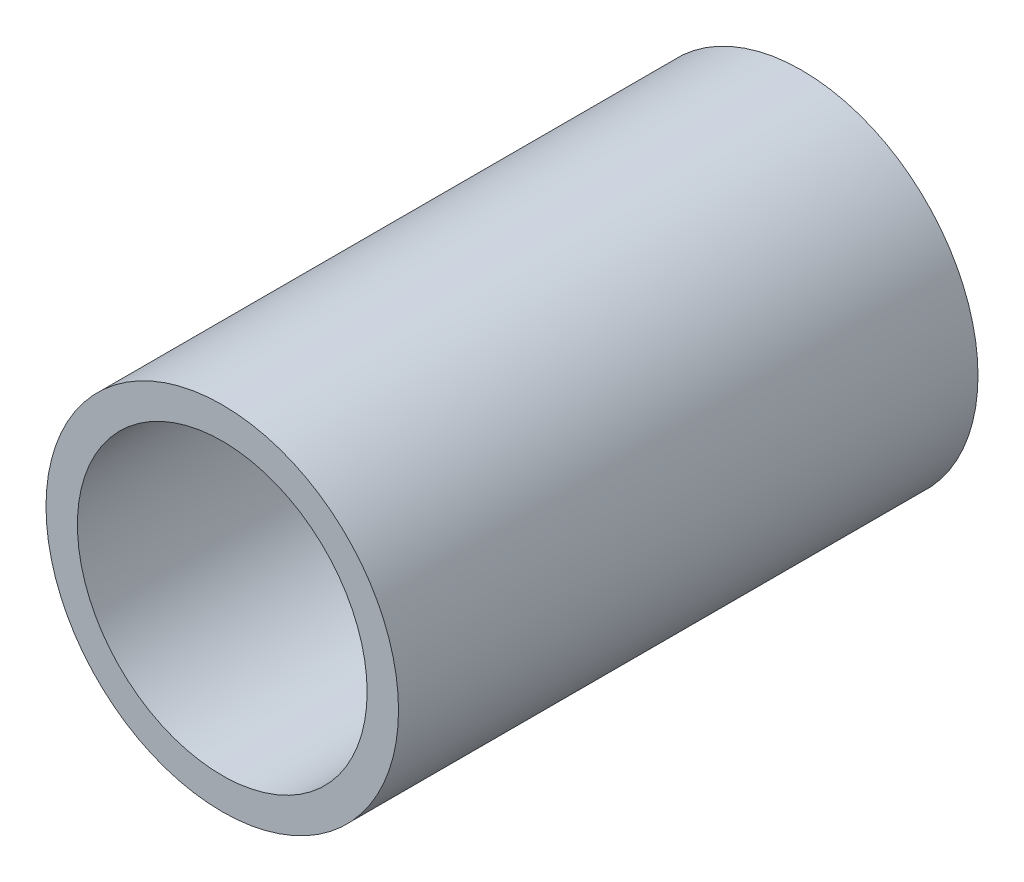
ISO-10303-21;
HEADER;
FILE_DESCRIPTION(('STEP AP214'),'2;1');
FILE_NAME('part.step','',(''),(''),'','','');
FILE_SCHEMA(('AUTOMOTIVE_DESIGN { 1 0 10303 214 1 1 1 1 }'));
ENDSEC;
DATA;
#1=APPLICATION_CONTEXT('core data for automotive mechanical design processes');
#2=APPLICATION_PROTOCOL_DEFINITION('international standard','automotive_design',2000,#1);
#3=PRODUCT_CONTEXT('',#1,'mechanical');
#4=PRODUCT('Part','Part','',(#3));
#5=PRODUCT_RELATED_PRODUCT_CATEGORY('part','',(#4));
#6=PRODUCT_DEFINITION_FORMATION('','',#4);
#7=PRODUCT_DEFINITION_CONTEXT('part definition',#1,'design');
#8=PRODUCT_DEFINITION('design','',#6,#7);
#9=PRODUCT_DEFINITION_SHAPE('','',#8);
#10=(LENGTH_UNIT() NAMED_UNIT(*) SI_UNIT(.MILLI.,.METRE.));
#11=(NAMED_UNIT(*) PLANE_ANGLE_UNIT() SI_UNIT($,.RADIAN.));
#12=(NAMED_UNIT(*) SI_UNIT($,.STERADIAN.) SOLID_ANGLE_UNIT());
#13=UNCERTAINTY_MEASURE_WITH_UNIT(LENGTH_MEASURE(1.E-05),#10,'distance_accuracy_value','');
#14=(GEOMETRIC_REPRESENTATION_CONTEXT(3) GLOBAL_UNCERTAINTY_ASSIGNED_CONTEXT((#13)) GLOBAL_UNIT_ASSIGNED_CONTEXT((#10,
#11,#12)) REPRESENTATION_CONTEXT('',''));
#15=CARTESIAN_POINT('',(0.,0.,0.));
#16=DIRECTION('',(0.,0.,1.));
#17=DIRECTION('',(1.,0.,0.));
#18=AXIS2_PLACEMENT_3D('',#15,#16,#17);
#19=CARTESIAN_POINT('',(0.,0.,12.));
#20=DIRECTION('',(0.,0.,1.));
#21=DIRECTION('',(1.,0.,0.));
#22=AXIS2_PLACEMENT_3D('',#19,#20,#21);
#23=PLANE('',#22);
#24=CARTESIAN_POINT('',(0.,0.,12.));
#25=DIRECTION('',(0.,0.,1.));
#26=DIRECTION('',(1.,0.,0.));
#27=AXIS2_PLACEMENT_3D('',#24,#25,#26);
#28=CIRCLE('',#27,3.65);
#29=CARTESIAN_POINT('',(3.65,0.,12.));
#30=VERTEX_POINT('',#29);
#31=EDGE_CURVE('E10',#30,#30,#28,.T.);
#32=ORIENTED_EDGE('',*,*,#31,.T.);
#33=EDGE_LOOP('',(#32));
#34=FACE_BOUND('',#33,.T.);
#35=CARTESIAN_POINT('',(0.,0.,12.));
#36=DIRECTION('',(0.,0.,1.));
#37=DIRECTION('',(1.,0.,0.));
#38=AXIS2_PLACEMENT_3D('',#35,#36,#37);
#39=CIRCLE('',#38,3.);
#40=CARTESIAN_POINT('',(3.,0.,12.));
#41=VERTEX_POINT('',#40);
#42=EDGE_CURVE('E41',#41,#41,#39,.T.);
#43=ORIENTED_EDGE('',*,*,#42,.F.);
#44=EDGE_LOOP('',(#43));
#45=FACE_BOUND('',#44,.T.);
#46=ADVANCED_FACE('F30',(#34,#45),#23,.T.);
#47=CARTESIAN_POINT('',(0.,0.,0.));
#48=DIRECTION('',(0.,0.,1.));
#49=DIRECTION('',(1.,0.,0.));
#50=AXIS2_PLACEMENT_3D('',#47,#48,#49);
#51=PLANE('',#50);
#52=CARTESIAN_POINT('',(0.,0.,0.));
#53=DIRECTION('',(0.,0.,1.));
#54=DIRECTION('',(1.,0.,0.));
#55=AXIS2_PLACEMENT_3D('',#52,#53,#54);
#56=CIRCLE('',#55,3.65);
#57=CARTESIAN_POINT('',(3.65,0.,0.));
#58=VERTEX_POINT('',#57);
#59=EDGE_CURVE('E34',#58,#58,#56,.T.);
#60=ORIENTED_EDGE('',*,*,#59,.F.);
#61=EDGE_LOOP('',(#60));
#62=FACE_BOUND('',#61,.T.);
#63=CARTESIAN_POINT('',(0.,0.,0.));
#64=DIRECTION('',(0.,0.,1.));
#65=DIRECTION('',(1.,0.,0.));
#66=AXIS2_PLACEMENT_3D('',#63,#64,#65);
#67=CIRCLE('',#66,3.);
#68=CARTESIAN_POINT('',(3.,0.,0.));
#69=VERTEX_POINT('',#68);
#70=EDGE_CURVE('E43',#69,#69,#67,.T.);
#71=ORIENTED_EDGE('',*,*,#70,.T.);
#72=EDGE_LOOP('',(#71));
#73=FACE_BOUND('',#72,.T.);
#74=ADVANCED_FACE('F53',(#62,#73),#51,.F.);
#75=CARTESIAN_POINT('',(0.,0.,12.));
#76=DIRECTION('',(0.,0.,-1.));
#77=DIRECTION('',(-1.,0.,0.));
#78=AXIS2_PLACEMENT_3D('',#75,#76,#77);
#79=CYLINDRICAL_SURFACE('',#78,3.65);
#80=ORIENTED_EDGE('',*,*,#31,.F.);
#81=EDGE_LOOP('',(#80));
#82=FACE_BOUND('',#81,.T.);
#83=ORIENTED_EDGE('',*,*,#59,.T.);
#84=EDGE_LOOP('',(#83));
#85=FACE_BOUND('',#84,.T.);
#86=ADVANCED_FACE('F32',(#82,#85),#79,.T.);
#87=CARTESIAN_POINT('',(0.,0.,12.));
#88=DIRECTION('',(0.,0.,-1.));
#89=DIRECTION('',(-1.,0.,0.));
#90=AXIS2_PLACEMENT_3D('',#87,#88,#89);
#91=CYLINDRICAL_SURFACE('',#90,3.);
#92=ORIENTED_EDGE('',*,*,#42,.T.);
#93=EDGE_LOOP('',(#92));
#94=FACE_BOUND('',#93,.T.);
#95=ORIENTED_EDGE('',*,*,#70,.F.);
#96=EDGE_LOOP('',(#95));
#97=FACE_BOUND('',#96,.T.);
#98=ADVANCED_FACE('F49',(#94,#97),#91,.F.);
#99=CLOSED_SHELL('',(#46,#74,#86,#98));
#100=MANIFOLD_SOLID_BREP('B2',#99);
#101=ADVANCED_BREP_SHAPE_REPRESENTATION('',(#18,#100),#14);
#102=SHAPE_DEFINITION_REPRESENTATION(#9,#101);
ENDSEC;
END-ISO-10303-21;
